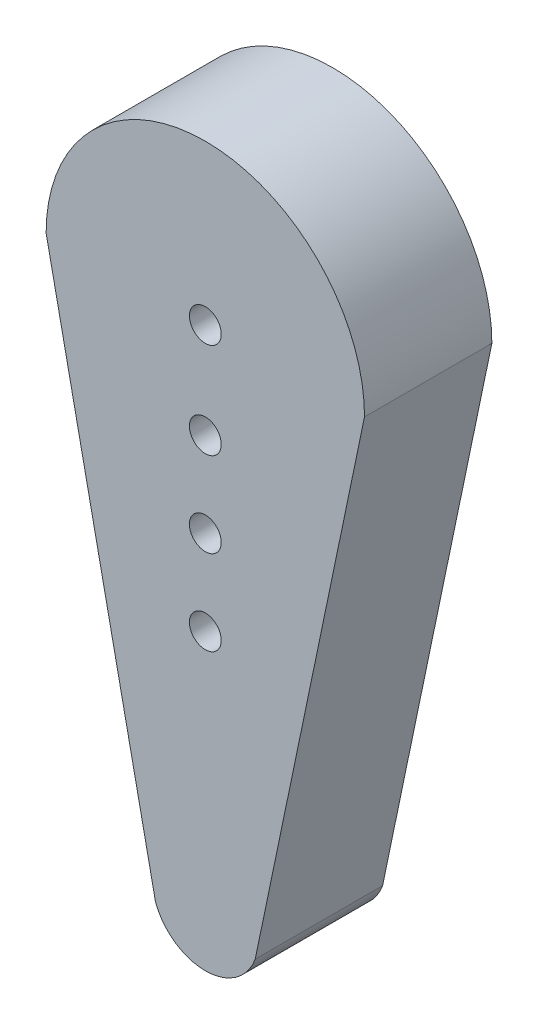
ISO-10303-21;
HEADER;
FILE_DESCRIPTION(('STEP AP214'),'2;1');
FILE_NAME('part.step','',(''),(''),'','','');
FILE_SCHEMA(('AUTOMOTIVE_DESIGN { 1 0 10303 214 1 1 1 1 }'));
ENDSEC;
DATA;
#1=APPLICATION_CONTEXT('core data for automotive mechanical design processes');
#2=APPLICATION_PROTOCOL_DEFINITION('international standard','automotive_design',2000,#1);
#3=PRODUCT_CONTEXT('',#1,'mechanical');
#4=PRODUCT('Part','Part','',(#3));
#5=PRODUCT_RELATED_PRODUCT_CATEGORY('part','',(#4));
#6=PRODUCT_DEFINITION_FORMATION('','',#4);
#7=PRODUCT_DEFINITION_CONTEXT('part definition',#1,'design');
#8=PRODUCT_DEFINITION('design','',#6,#7);
#9=PRODUCT_DEFINITION_SHAPE('','',#8);
#10=(LENGTH_UNIT() NAMED_UNIT(*) SI_UNIT(.MILLI.,.METRE.));
#11=(NAMED_UNIT(*) PLANE_ANGLE_UNIT() SI_UNIT($,.RADIAN.));
#12=(NAMED_UNIT(*) SI_UNIT($,.STERADIAN.) SOLID_ANGLE_UNIT());
#13=UNCERTAINTY_MEASURE_WITH_UNIT(LENGTH_MEASURE(1.E-05),#10,'distance_accuracy_value','');
#14=(GEOMETRIC_REPRESENTATION_CONTEXT(3) GLOBAL_UNCERTAINTY_ASSIGNED_CONTEXT((#13)) GLOBAL_UNIT_ASSIGNED_CONTEXT((#10,
#11,#12)) REPRESENTATION_CONTEXT('',''));
#15=CARTESIAN_POINT('',(0.,0.,0.));
#16=DIRECTION('',(0.,0.,1.));
#17=DIRECTION('',(1.,0.,0.));
#18=AXIS2_PLACEMENT_3D('',#15,#16,#17);
#19=CARTESIAN_POINT('',(0.,-12.5,6.));
#20=DIRECTION('',(0.,0.,-1.));
#21=DIRECTION('',(-1.,0.,0.));
#22=AXIS2_PLACEMENT_3D('',#19,#20,#21);
#23=CYLINDRICAL_SURFACE('',#22,0.75);
#24=CARTESIAN_POINT('',(0.,-12.5,6.));
#25=DIRECTION('',(0.,0.,-1.));
#26=DIRECTION('',(-1.,0.,0.));
#27=AXIS2_PLACEMENT_3D('',#24,#25,#26);
#28=CIRCLE('',#27,0.75);
#29=CARTESIAN_POINT('',(-0.75,-12.5,6.));
#30=VERTEX_POINT('',#29);
#31=EDGE_CURVE('E41',#30,#30,#28,.T.);
#32=ORIENTED_EDGE('',*,*,#31,.F.);
#33=EDGE_LOOP('',(#32));
#34=FACE_BOUND('',#33,.T.);
#35=CARTESIAN_POINT('',(0.,-12.5,4.7));
#36=DIRECTION('',(0.,0.,1.));
#37=DIRECTION('',(1.,0.,0.));
#38=AXIS2_PLACEMENT_3D('',#35,#36,#37);
#39=CIRCLE('',#38,0.75);
#40=CARTESIAN_POINT('',(0.75,-12.5,4.7));
#41=VERTEX_POINT('',#40);
#42=EDGE_CURVE('E11',#41,#41,#39,.T.);
#43=ORIENTED_EDGE('',*,*,#42,.F.);
#44=EDGE_LOOP('',(#43));
#45=FACE_BOUND('',#44,.T.);
#46=ADVANCED_FACE('F34',(#34,#45),#23,.F.);
#47=CARTESIAN_POINT('',(0.,0.,0.));
#48=DIRECTION('',(0.,0.,1.));
#49=DIRECTION('',(1.,0.,0.));
#50=AXIS2_PLACEMENT_3D('',#47,#48,#49);
#51=PLANE('',#50);
#52=CARTESIAN_POINT('',(0.,0.,0.));
#53=DIRECTION('',(0.,0.,1.));
#54=DIRECTION('',(1.,0.,0.));
#55=AXIS2_PLACEMENT_3D('',#52,#53,#54);
#56=CIRCLE('',#55,7.5);
#57=CARTESIAN_POINT('',(7.5,0.,0.));
#58=VERTEX_POINT('',#57);
#59=CARTESIAN_POINT('',(-7.5,0.,0.));
#60=VERTEX_POINT('',#59);
#61=EDGE_CURVE('E129',#58,#60,#56,.T.);
#62=ORIENTED_EDGE('',*,*,#61,.F.);
#63=DIRECTION('',(0.204083469328781,0.978953491002881,0.));
#64=VECTOR('',#63,1.);
#65=CARTESIAN_POINT('',(7.5,0.,0.));
#66=LINE('',#65,#64);
#67=CARTESIAN_POINT('',(2.35035930182459,-24.7019455101863,0.));
#68=VERTEX_POINT('',#67);
#69=EDGE_CURVE('E78',#68,#58,#66,.T.);
#70=ORIENTED_EDGE('',*,*,#69,.F.);
#71=CARTESIAN_POINT('',(0.,-23.85,0.));
#72=DIRECTION('',(0.,0.,1.));
#73=DIRECTION('',(1.,0.,0.));
#74=AXIS2_PLACEMENT_3D('',#71,#72,#73);
#75=CIRCLE('',#74,2.5);
#76=CARTESIAN_POINT('',(-2.34733918851059,-24.7102317909043,0.));
#77=VERTEX_POINT('',#76);
#78=EDGE_CURVE('E147',#77,#68,#75,.T.);
#79=ORIENTED_EDGE('',*,*,#78,.F.);
#80=DIRECTION('',(0.204132547466348,-0.978943258347949,0.));
#81=VECTOR('',#80,1.);
#82=CARTESIAN_POINT('',(-7.5,0.,0.));
#83=LINE('',#82,#81);
#84=EDGE_CURVE('E133',#60,#77,#83,.T.);
#85=ORIENTED_EDGE('',*,*,#84,.F.);
#86=EDGE_LOOP('',(#62,#70,#79,#85));
#87=FACE_BOUND('',#86,.T.);
#88=CARTESIAN_POINT('',(0.,0.,0.));
#89=DIRECTION('',(0.,0.,1.));
#90=DIRECTION('',(1.,0.,0.));
#91=AXIS2_PLACEMENT_3D('',#88,#89,#90);
#92=CIRCLE('',#91,3.75);
#93=CARTESIAN_POINT('',(3.75,0.,0.));
#94=VERTEX_POINT('',#93);
#95=CARTESIAN_POINT('',(-3.75,0.,0.));
#96=VERTEX_POINT('',#95);
#97=EDGE_CURVE('E48',#94,#96,#92,.T.);
#98=ORIENTED_EDGE('',*,*,#97,.T.);
#99=DIRECTION('',(0.0995037190209989,-0.995037190209989,0.));
#100=VECTOR('',#99,1.);
#101=CARTESIAN_POINT('',(-3.75,0.,0.));
#102=LINE('',#101,#100);
#103=CARTESIAN_POINT('',(-2.25,-15.,0.));
#104=VERTEX_POINT('',#103);
#105=EDGE_CURVE('E128',#96,#104,#102,.T.);
#106=ORIENTED_EDGE('',*,*,#105,.T.);
#107=CARTESIAN_POINT('',(0.,-15.,0.));
#108=DIRECTION('',(0.,0.,1.));
#109=DIRECTION('',(1.,0.,0.));
#110=AXIS2_PLACEMENT_3D('',#107,#108,#109);
#111=CIRCLE('',#110,2.25);
#112=CARTESIAN_POINT('',(2.25,-15.,0.));
#113=VERTEX_POINT('',#112);
#114=EDGE_CURVE('E231',#104,#113,#111,.T.);
#115=ORIENTED_EDGE('',*,*,#114,.T.);
#116=DIRECTION('',(0.0995037190209989,0.995037190209989,0.));
#117=VECTOR('',#116,1.);
#118=CARTESIAN_POINT('',(2.25,-15.,0.));
#119=LINE('',#118,#117);
#120=EDGE_CURVE('E124',#113,#94,#119,.T.);
#121=ORIENTED_EDGE('',*,*,#120,.T.);
#122=EDGE_LOOP('',(#98,#106,#115,#121));
#123=FACE_BOUND('',#122,.T.);
#124=ADVANCED_FACE('F172',(#87,#123),#51,.F.);
#125=CARTESIAN_POINT('',(0.,0.,6.));
#126=DIRECTION('',(0.,0.,-1.));
#127=DIRECTION('',(-1.,0.,0.));
#128=AXIS2_PLACEMENT_3D('',#125,#126,#127);
#129=CYLINDRICAL_SURFACE('',#128,7.5);
#130=ORIENTED_EDGE('',*,*,#61,.T.);
#131=DIRECTION('',(0.,0.,-1.));
#132=VECTOR('',#131,1.);
#133=CARTESIAN_POINT('',(-7.5,0.,6.));
#134=LINE('',#133,#132);
#135=CARTESIAN_POINT('',(-7.5,0.,6.));
#136=VERTEX_POINT('',#135);
#137=EDGE_CURVE('E156',#136,#60,#134,.T.);
#138=ORIENTED_EDGE('',*,*,#137,.F.);
#139=CARTESIAN_POINT('',(0.,0.,6.));
#140=DIRECTION('',(0.,0.,1.));
#141=DIRECTION('',(1.,0.,0.));
#142=AXIS2_PLACEMENT_3D('',#139,#140,#141);
#143=CIRCLE('',#142,7.5);
#144=CARTESIAN_POINT('',(7.5,0.,6.));
#145=VERTEX_POINT('',#144);
#146=EDGE_CURVE('E139',#145,#136,#143,.T.);
#147=ORIENTED_EDGE('',*,*,#146,.F.);
#148=DIRECTION('',(0.,0.,-1.));
#149=VECTOR('',#148,1.);
#150=CARTESIAN_POINT('',(7.5,0.,6.));
#151=LINE('',#150,#149);
#152=EDGE_CURVE('E144',#145,#58,#151,.T.);
#153=ORIENTED_EDGE('',*,*,#152,.T.);
#154=EDGE_LOOP('',(#130,#138,#147,#153));
#155=FACE_BOUND('',#154,.T.);
#156=ADVANCED_FACE('F206',(#155),#129,.T.);
#157=CARTESIAN_POINT('',(-7.5,0.,6.));
#158=DIRECTION('',(0.978943258347949,0.204132547466348,0.));
#159=DIRECTION('',(-0.204132547466348,0.978943258347949,0.));
#160=AXIS2_PLACEMENT_3D('',#157,#158,#159);
#161=PLANE('',#160);
#162=ORIENTED_EDGE('',*,*,#84,.T.);
#163=DIRECTION('',(0.,0.,-1.));
#164=VECTOR('',#163,1.);
#165=CARTESIAN_POINT('',(-2.34733918851059,-24.7102317909043,6.));
#166=LINE('',#165,#164);
#167=CARTESIAN_POINT('',(-2.34733918851059,-24.7102317909043,6.));
#168=VERTEX_POINT('',#167);
#169=EDGE_CURVE('E153',#168,#77,#166,.T.);
#170=ORIENTED_EDGE('',*,*,#169,.F.);
#171=DIRECTION('',(0.204132547466348,-0.978943258347949,0.));
#172=VECTOR('',#171,1.);
#173=CARTESIAN_POINT('',(-7.5,0.,6.));
#174=LINE('',#173,#172);
#175=EDGE_CURVE('E86',#136,#168,#174,.T.);
#176=ORIENTED_EDGE('',*,*,#175,.F.);
#177=ORIENTED_EDGE('',*,*,#137,.T.);
#178=EDGE_LOOP('',(#162,#170,#176,#177));
#179=FACE_BOUND('',#178,.T.);
#180=ADVANCED_FACE('F213',(#179),#161,.F.);
#181=CARTESIAN_POINT('',(0.,-23.85,6.));
#182=DIRECTION('',(0.,0.,-1.));
#183=DIRECTION('',(-1.,0.,0.));
#184=AXIS2_PLACEMENT_3D('',#181,#182,#183);
#185=CYLINDRICAL_SURFACE('',#184,2.5);
#186=ORIENTED_EDGE('',*,*,#78,.T.);
#187=DIRECTION('',(0.,0.,-1.));
#188=VECTOR('',#187,1.);
#189=CARTESIAN_POINT('',(2.35035930182459,-24.7019455101863,6.));
#190=LINE('',#189,#188);
#191=CARTESIAN_POINT('',(2.35035930182459,-24.7019455101863,6.));
#192=VERTEX_POINT('',#191);
#193=EDGE_CURVE('E151',#192,#68,#190,.T.);
#194=ORIENTED_EDGE('',*,*,#193,.F.);
#195=CARTESIAN_POINT('',(0.,-23.85,6.));
#196=DIRECTION('',(0.,0.,1.));
#197=DIRECTION('',(1.,0.,0.));
#198=AXIS2_PLACEMENT_3D('',#195,#196,#197);
#199=CIRCLE('',#198,2.5);
#200=EDGE_CURVE('E142',#168,#192,#199,.T.);
#201=ORIENTED_EDGE('',*,*,#200,.F.);
#202=ORIENTED_EDGE('',*,*,#169,.T.);
#203=EDGE_LOOP('',(#186,#194,#201,#202));
#204=FACE_BOUND('',#203,.T.);
#205=ADVANCED_FACE('F210',(#204),#185,.T.);
#206=CARTESIAN_POINT('',(7.5,0.,6.));
#207=DIRECTION('',(-0.978953491002881,0.204083469328781,0.));
#208=DIRECTION('',(-0.204083469328781,-0.978953491002881,0.));
#209=AXIS2_PLACEMENT_3D('',#206,#207,#208);
#210=PLANE('',#209);
#211=ORIENTED_EDGE('',*,*,#69,.T.);
#212=ORIENTED_EDGE('',*,*,#152,.F.);
#213=DIRECTION('',(0.204083469328781,0.978953491002881,0.));
#214=VECTOR('',#213,1.);
#215=CARTESIAN_POINT('',(7.5,0.,6.));
#216=LINE('',#215,#214);
#217=EDGE_CURVE('E57',#192,#145,#216,.T.);
#218=ORIENTED_EDGE('',*,*,#217,.F.);
#219=ORIENTED_EDGE('',*,*,#193,.T.);
#220=EDGE_LOOP('',(#211,#212,#218,#219));
#221=FACE_BOUND('',#220,.T.);
#222=ADVANCED_FACE('F202',(#221),#210,.F.);
#223=CARTESIAN_POINT('',(0.,0.,6.));
#224=DIRECTION('',(0.,0.,1.));
#225=DIRECTION('',(1.,0.,0.));
#226=AXIS2_PLACEMENT_3D('',#223,#224,#225);
#227=PLANE('',#226);
#228=CARTESIAN_POINT('',(0.,-8.5,6.));
#229=DIRECTION('',(0.,0.,-1.));
#230=DIRECTION('',(-1.,0.,0.));
#231=AXIS2_PLACEMENT_3D('',#228,#229,#230);
#232=CIRCLE('',#231,0.75);
#233=CARTESIAN_POINT('',(-0.75,-8.5,6.));
#234=VERTEX_POINT('',#233);
#235=EDGE_CURVE('E248',#234,#234,#232,.T.);
#236=ORIENTED_EDGE('',*,*,#235,.T.);
#237=EDGE_LOOP('',(#236));
#238=FACE_BOUND('',#237,.T.);
#239=CARTESIAN_POINT('',(0.,-4.5,6.));
#240=DIRECTION('',(0.,0.,-1.));
#241=DIRECTION('',(-1.,0.,0.));
#242=AXIS2_PLACEMENT_3D('',#239,#240,#241);
#243=CIRCLE('',#242,0.75);
#244=CARTESIAN_POINT('',(-0.75,-4.5,6.));
#245=VERTEX_POINT('',#244);
#246=EDGE_CURVE('E164',#245,#245,#243,.T.);
#247=ORIENTED_EDGE('',*,*,#246,.T.);
#248=EDGE_LOOP('',(#247));
#249=FACE_BOUND('',#248,.T.);
#250=CARTESIAN_POINT('',(0.,0.,6.));
#251=DIRECTION('',(0.,0.,-1.));
#252=DIRECTION('',(-1.,0.,0.));
#253=AXIS2_PLACEMENT_3D('',#250,#251,#252);
#254=CIRCLE('',#253,0.75);
#255=CARTESIAN_POINT('',(-0.75,0.,6.));
#256=VERTEX_POINT('',#255);
#257=EDGE_CURVE('E161',#256,#256,#254,.T.);
#258=ORIENTED_EDGE('',*,*,#257,.T.);
#259=EDGE_LOOP('',(#258));
#260=FACE_BOUND('',#259,.T.);
#261=ORIENTED_EDGE('',*,*,#146,.T.);
#262=ORIENTED_EDGE('',*,*,#175,.T.);
#263=ORIENTED_EDGE('',*,*,#200,.T.);
#264=ORIENTED_EDGE('',*,*,#217,.T.);
#265=EDGE_LOOP('',(#261,#262,#263,#264));
#266=FACE_BOUND('',#265,.T.);
#267=ORIENTED_EDGE('',*,*,#31,.T.);
#268=EDGE_LOOP('',(#267));
#269=FACE_BOUND('',#268,.T.);
#270=ADVANCED_FACE('F168',(#238,#249,#260,#266,#269),#227,.T.);
#271=CARTESIAN_POINT('',(0.,0.,4.7));
#272=DIRECTION('',(0.,0.,-1.));
#273=DIRECTION('',(-1.,0.,0.));
#274=AXIS2_PLACEMENT_3D('',#271,#272,#273);
#275=CYLINDRICAL_SURFACE('',#274,3.75);
#276=ORIENTED_EDGE('',*,*,#97,.F.);
#277=DIRECTION('',(0.,0.,-1.));
#278=VECTOR('',#277,1.);
#279=CARTESIAN_POINT('',(3.75,0.,4.7));
#280=LINE('',#279,#278);
#281=CARTESIAN_POINT('',(3.75,0.,4.7));
#282=VERTEX_POINT('',#281);
#283=EDGE_CURVE('E123',#282,#94,#280,.T.);
#284=ORIENTED_EDGE('',*,*,#283,.F.);
#285=CARTESIAN_POINT('',(0.,0.,4.7));
#286=DIRECTION('',(0.,0.,1.));
#287=DIRECTION('',(1.,0.,0.));
#288=AXIS2_PLACEMENT_3D('',#285,#286,#287);
#289=CIRCLE('',#288,3.75);
#290=CARTESIAN_POINT('',(-3.75,0.,4.7));
#291=VERTEX_POINT('',#290);
#292=EDGE_CURVE('E115',#282,#291,#289,.T.);
#293=ORIENTED_EDGE('',*,*,#292,.T.);
#294=DIRECTION('',(0.,0.,-1.));
#295=VECTOR('',#294,1.);
#296=CARTESIAN_POINT('',(-3.75,0.,4.7));
#297=LINE('',#296,#295);
#298=EDGE_CURVE('E122',#291,#96,#297,.T.);
#299=ORIENTED_EDGE('',*,*,#298,.T.);
#300=EDGE_LOOP('',(#276,#284,#293,#299));
#301=FACE_BOUND('',#300,.T.);
#302=ADVANCED_FACE('F121',(#301),#275,.F.);
#303=CARTESIAN_POINT('',(-3.75,0.,4.7));
#304=DIRECTION('',(0.995037190209989,0.0995037190209989,0.));
#305=DIRECTION('',(-0.0995037190209989,0.995037190209989,0.));
#306=AXIS2_PLACEMENT_3D('',#303,#304,#305);
#307=PLANE('',#306);
#308=ORIENTED_EDGE('',*,*,#105,.F.);
#309=ORIENTED_EDGE('',*,*,#298,.F.);
#310=DIRECTION('',(0.0995037190209989,-0.995037190209989,0.));
#311=VECTOR('',#310,1.);
#312=CARTESIAN_POINT('',(-3.75,0.,4.7));
#313=LINE('',#312,#311);
#314=CARTESIAN_POINT('',(-2.25,-15.,4.7));
#315=VERTEX_POINT('',#314);
#316=EDGE_CURVE('E110',#291,#315,#313,.T.);
#317=ORIENTED_EDGE('',*,*,#316,.T.);
#318=DIRECTION('',(0.,0.,-1.));
#319=VECTOR('',#318,1.);
#320=CARTESIAN_POINT('',(-2.25,-15.,4.7));
#321=LINE('',#320,#319);
#322=EDGE_CURVE('E130',#315,#104,#321,.T.);
#323=ORIENTED_EDGE('',*,*,#322,.T.);
#324=EDGE_LOOP('',(#308,#309,#317,#323));
#325=FACE_BOUND('',#324,.T.);
#326=ADVANCED_FACE('F126',(#325),#307,.T.);
#327=CARTESIAN_POINT('',(0.,-15.,4.7));
#328=DIRECTION('',(0.,0.,-1.));
#329=DIRECTION('',(-1.,0.,0.));
#330=AXIS2_PLACEMENT_3D('',#327,#328,#329);
#331=CYLINDRICAL_SURFACE('',#330,2.25);
#332=ORIENTED_EDGE('',*,*,#114,.F.);
#333=ORIENTED_EDGE('',*,*,#322,.F.);
#334=CARTESIAN_POINT('',(0.,-15.,4.7));
#335=DIRECTION('',(0.,0.,1.));
#336=DIRECTION('',(1.,0.,0.));
#337=AXIS2_PLACEMENT_3D('',#334,#335,#336);
#338=CIRCLE('',#337,2.25);
#339=CARTESIAN_POINT('',(2.25,-15.,4.7));
#340=VERTEX_POINT('',#339);
#341=EDGE_CURVE('E116',#315,#340,#338,.T.);
#342=ORIENTED_EDGE('',*,*,#341,.T.);
#343=DIRECTION('',(0.,0.,-1.));
#344=VECTOR('',#343,1.);
#345=CARTESIAN_POINT('',(2.25,-15.,4.7));
#346=LINE('',#345,#344);
#347=EDGE_CURVE('E135',#340,#113,#346,.T.);
#348=ORIENTED_EDGE('',*,*,#347,.T.);
#349=EDGE_LOOP('',(#332,#333,#342,#348));
#350=FACE_BOUND('',#349,.T.);
#351=ADVANCED_FACE('F186',(#350),#331,.F.);
#352=CARTESIAN_POINT('',(2.25,-15.,4.7));
#353=DIRECTION('',(-0.995037190209989,0.0995037190209989,0.));
#354=DIRECTION('',(-0.0995037190209989,-0.995037190209989,0.));
#355=AXIS2_PLACEMENT_3D('',#352,#353,#354);
#356=PLANE('',#355);
#357=ORIENTED_EDGE('',*,*,#120,.F.);
#358=ORIENTED_EDGE('',*,*,#347,.F.);
#359=DIRECTION('',(0.0995037190209989,0.995037190209989,0.));
#360=VECTOR('',#359,1.);
#361=CARTESIAN_POINT('',(2.25,-15.,4.7));
#362=LINE('',#361,#360);
#363=EDGE_CURVE('E234',#340,#282,#362,.T.);
#364=ORIENTED_EDGE('',*,*,#363,.T.);
#365=ORIENTED_EDGE('',*,*,#283,.T.);
#366=EDGE_LOOP('',(#357,#358,#364,#365));
#367=FACE_BOUND('',#366,.T.);
#368=ADVANCED_FACE('F176',(#367),#356,.T.);
#369=CARTESIAN_POINT('',(0.,0.,4.7));
#370=DIRECTION('',(0.,0.,1.));
#371=DIRECTION('',(1.,0.,0.));
#372=AXIS2_PLACEMENT_3D('',#369,#370,#371);
#373=PLANE('',#372);
#374=CARTESIAN_POINT('',(0.,-8.5,4.7));
#375=DIRECTION('',(0.,0.,1.));
#376=DIRECTION('',(1.,0.,0.));
#377=AXIS2_PLACEMENT_3D('',#374,#375,#376);
#378=CIRCLE('',#377,0.75);
#379=CARTESIAN_POINT('',(0.75,-8.5,4.7));
#380=VERTEX_POINT('',#379);
#381=EDGE_CURVE('E246',#380,#380,#378,.T.);
#382=ORIENTED_EDGE('',*,*,#381,.T.);
#383=EDGE_LOOP('',(#382));
#384=FACE_BOUND('',#383,.T.);
#385=CARTESIAN_POINT('',(0.,-4.5,4.7));
#386=DIRECTION('',(0.,0.,1.));
#387=DIRECTION('',(1.,0.,0.));
#388=AXIS2_PLACEMENT_3D('',#385,#386,#387);
#389=CIRCLE('',#388,0.75);
#390=CARTESIAN_POINT('',(0.75,-4.5,4.7));
#391=VERTEX_POINT('',#390);
#392=EDGE_CURVE('E162',#391,#391,#389,.T.);
#393=ORIENTED_EDGE('',*,*,#392,.T.);
#394=EDGE_LOOP('',(#393));
#395=FACE_BOUND('',#394,.T.);
#396=CARTESIAN_POINT('',(0.,0.,4.7));
#397=DIRECTION('',(0.,0.,1.));
#398=DIRECTION('',(1.,0.,0.));
#399=AXIS2_PLACEMENT_3D('',#396,#397,#398);
#400=CIRCLE('',#399,0.75);
#401=CARTESIAN_POINT('',(0.75,0.,4.7));
#402=VERTEX_POINT('',#401);
#403=EDGE_CURVE('E158',#402,#402,#400,.T.);
#404=ORIENTED_EDGE('',*,*,#403,.T.);
#405=EDGE_LOOP('',(#404));
#406=FACE_BOUND('',#405,.T.);
#407=ORIENTED_EDGE('',*,*,#292,.F.);
#408=ORIENTED_EDGE('',*,*,#363,.F.);
#409=ORIENTED_EDGE('',*,*,#341,.F.);
#410=ORIENTED_EDGE('',*,*,#316,.F.);
#411=EDGE_LOOP('',(#407,#408,#409,#410));
#412=FACE_BOUND('',#411,.T.);
#413=ORIENTED_EDGE('',*,*,#42,.T.);
#414=EDGE_LOOP('',(#413));
#415=FACE_BOUND('',#414,.T.);
#416=ADVANCED_FACE('F112',(#384,#395,#406,#412,#415),#373,.F.);
#417=CARTESIAN_POINT('',(0.,0.,6.));
#418=DIRECTION('',(0.,0.,-1.));
#419=DIRECTION('',(-1.,0.,0.));
#420=AXIS2_PLACEMENT_3D('',#417,#418,#419);
#421=CYLINDRICAL_SURFACE('',#420,0.75);
#422=ORIENTED_EDGE('',*,*,#257,.F.);
#423=EDGE_LOOP('',(#422));
#424=FACE_BOUND('',#423,.T.);
#425=ORIENTED_EDGE('',*,*,#403,.F.);
#426=EDGE_LOOP('',(#425));
#427=FACE_BOUND('',#426,.T.);
#428=ADVANCED_FACE('F175',(#424,#427),#421,.F.);
#429=CARTESIAN_POINT('',(0.,-4.5,6.));
#430=DIRECTION('',(0.,0.,-1.));
#431=DIRECTION('',(-1.,0.,0.));
#432=AXIS2_PLACEMENT_3D('',#429,#430,#431);
#433=CYLINDRICAL_SURFACE('',#432,0.75);
#434=ORIENTED_EDGE('',*,*,#246,.F.);
#435=EDGE_LOOP('',(#434));
#436=FACE_BOUND('',#435,.T.);
#437=ORIENTED_EDGE('',*,*,#392,.F.);
#438=EDGE_LOOP('',(#437));
#439=FACE_BOUND('',#438,.T.);
#440=ADVANCED_FACE('F183',(#436,#439),#433,.F.);
#441=CARTESIAN_POINT('',(0.,-8.5,6.));
#442=DIRECTION('',(0.,0.,-1.));
#443=DIRECTION('',(-1.,0.,0.));
#444=AXIS2_PLACEMENT_3D('',#441,#442,#443);
#445=CYLINDRICAL_SURFACE('',#444,0.75);
#446=ORIENTED_EDGE('',*,*,#235,.F.);
#447=EDGE_LOOP('',(#446));
#448=FACE_BOUND('',#447,.T.);
#449=ORIENTED_EDGE('',*,*,#381,.F.);
#450=EDGE_LOOP('',(#449));
#451=FACE_BOUND('',#450,.T.);
#452=ADVANCED_FACE('F253',(#448,#451),#445,.F.);
#453=CLOSED_SHELL('',(#46,#124,#156,#180,#205,#222,#270,#302,#326,#351,#368,#416,#428,#440,#452));
#454=MANIFOLD_SOLID_BREP('B2',#453);
#455=ADVANCED_BREP_SHAPE_REPRESENTATION('',(#18,#454),#14);
#456=SHAPE_DEFINITION_REPRESENTATION(#9,#455);
ENDSEC;
END-ISO-10303-21;
